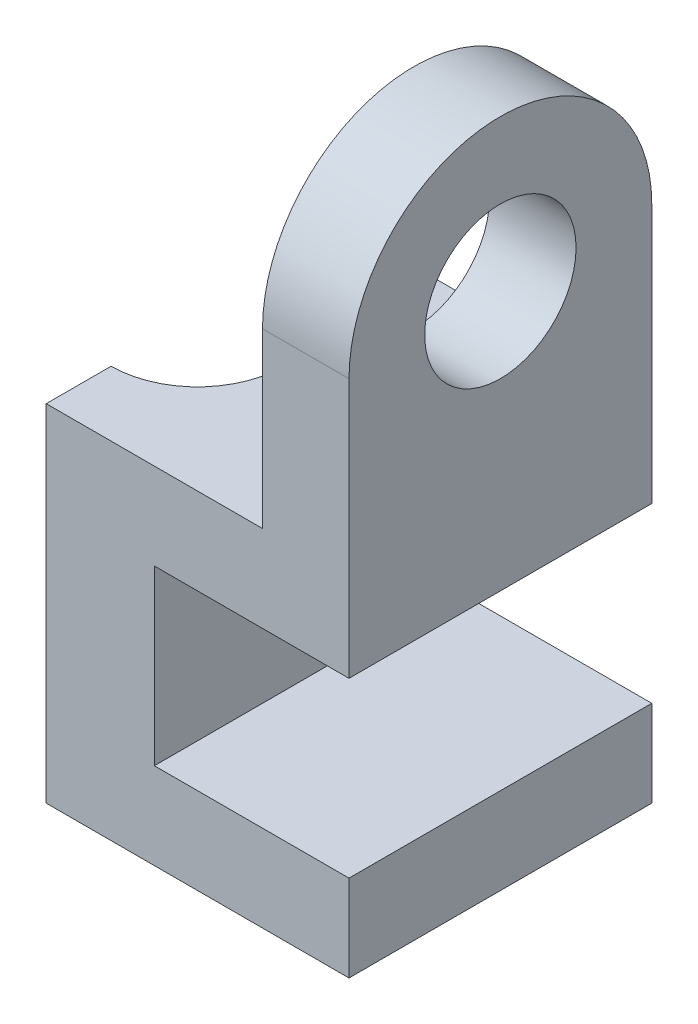
ISO-10303-21;
HEADER;
FILE_DESCRIPTION(('STEP AP214'),'2;1');
FILE_NAME('part.step','',(''),(''),'','','');
FILE_SCHEMA(('AUTOMOTIVE_DESIGN { 1 0 10303 214 1 1 1 1 }'));
ENDSEC;
DATA;
#1=APPLICATION_CONTEXT('core data for automotive mechanical design processes');
#2=APPLICATION_PROTOCOL_DEFINITION('international standard','automotive_design',2000,#1);
#3=PRODUCT_CONTEXT('',#1,'mechanical');
#4=PRODUCT('Part','Part','',(#3));
#5=PRODUCT_RELATED_PRODUCT_CATEGORY('part','',(#4));
#6=PRODUCT_DEFINITION_FORMATION('','',#4);
#7=PRODUCT_DEFINITION_CONTEXT('part definition',#1,'design');
#8=PRODUCT_DEFINITION('design','',#6,#7);
#9=PRODUCT_DEFINITION_SHAPE('','',#8);
#10=(LENGTH_UNIT() NAMED_UNIT(*) SI_UNIT(.MILLI.,.METRE.));
#11=(NAMED_UNIT(*) PLANE_ANGLE_UNIT() SI_UNIT($,.RADIAN.));
#12=(NAMED_UNIT(*) SI_UNIT($,.STERADIAN.) SOLID_ANGLE_UNIT());
#13=UNCERTAINTY_MEASURE_WITH_UNIT(LENGTH_MEASURE(1.E-05),#10,'distance_accuracy_value','');
#14=(GEOMETRIC_REPRESENTATION_CONTEXT(3) GLOBAL_UNCERTAINTY_ASSIGNED_CONTEXT((#13)) GLOBAL_UNIT_ASSIGNED_CONTEXT((#10,
#11,#12)) REPRESENTATION_CONTEXT('',''));
#15=CARTESIAN_POINT('',(0.,0.,0.));
#16=DIRECTION('',(0.,0.,1.));
#17=DIRECTION('',(1.,0.,0.));
#18=AXIS2_PLACEMENT_3D('',#15,#16,#17);
#19=CARTESIAN_POINT('',(-35.,40.,70.));
#20=DIRECTION('',(1.,0.,0.));
#21=DIRECTION('',(0.,1.,0.));
#22=AXIS2_PLACEMENT_3D('',#19,#20,#21);
#23=PLANE('',#22);
#24=DIRECTION('',(0.,0.,-1.));
#25=VECTOR('',#24,1.);
#26=CARTESIAN_POINT('',(-35.,-40.,70.));
#27=LINE('',#26,#25);
#28=CARTESIAN_POINT('',(-35.,-40.,15.));
#29=VERTEX_POINT('',#28);
#30=CARTESIAN_POINT('',(-35.,-40.,0.));
#31=VERTEX_POINT('',#30);
#32=EDGE_CURVE('E127',#29,#31,#27,.T.);
#33=ORIENTED_EDGE('',*,*,#32,.F.);
#34=DIRECTION('',(0.,1.,0.));
#35=VECTOR('',#34,1.);
#36=CARTESIAN_POINT('',(-35.,-40.,15.));
#37=LINE('',#36,#35);
#38=CARTESIAN_POINT('',(-35.,40.,15.));
#39=VERTEX_POINT('',#38);
#40=EDGE_CURVE('E58',#29,#39,#37,.T.);
#41=ORIENTED_EDGE('',*,*,#40,.T.);
#42=DIRECTION('',(0.,0.,-1.));
#43=VECTOR('',#42,1.);
#44=CARTESIAN_POINT('',(-35.,40.,70.));
#45=LINE('',#44,#43);
#46=CARTESIAN_POINT('',(-35.,40.,0.));
#47=VERTEX_POINT('',#46);
#48=EDGE_CURVE('E42',#39,#47,#45,.T.);
#49=ORIENTED_EDGE('',*,*,#48,.T.);
#50=DIRECTION('',(0.,-1.,0.));
#51=VECTOR('',#50,1.);
#52=CARTESIAN_POINT('',(-35.,40.,0.));
#53=LINE('',#52,#51);
#54=EDGE_CURVE('E133',#47,#31,#53,.T.);
#55=ORIENTED_EDGE('',*,*,#54,.T.);
#56=EDGE_LOOP('',(#33,#41,#49,#55));
#57=FACE_BOUND('',#56,.T.);
#58=ADVANCED_FACE('F33',(#57),#23,.F.);
#59=CARTESIAN_POINT('',(35.,40.,70.));
#60=DIRECTION('',(-1.,0.,0.));
#61=DIRECTION('',(0.,-1.,0.));
#62=AXIS2_PLACEMENT_3D('',#59,#60,#61);
#63=PLANE('',#62);
#64=DIRECTION('',(0.,1.,0.));
#65=VECTOR('',#64,1.);
#66=CARTESIAN_POINT('',(35.,40.,0.));
#67=LINE('',#66,#65);
#68=CARTESIAN_POINT('',(35.,-40.,0.));
#69=VERTEX_POINT('',#68);
#70=CARTESIAN_POINT('',(35.,-20.,0.));
#71=VERTEX_POINT('',#70);
#72=EDGE_CURVE('E139',#69,#71,#67,.T.);
#73=ORIENTED_EDGE('',*,*,#72,.T.);
#74=DIRECTION('',(0.,0.,1.));
#75=VECTOR('',#74,1.);
#76=CARTESIAN_POINT('',(35.,-20.,0.));
#77=LINE('',#76,#75);
#78=CARTESIAN_POINT('',(35.,-20.,70.));
#79=VERTEX_POINT('',#78);
#80=EDGE_CURVE('E154',#71,#79,#77,.T.);
#81=ORIENTED_EDGE('',*,*,#80,.T.);
#82=DIRECTION('',(0.,1.,0.));
#83=VECTOR('',#82,1.);
#84=CARTESIAN_POINT('',(35.,40.,70.));
#85=LINE('',#84,#83);
#86=CARTESIAN_POINT('',(35.,-40.,70.));
#87=VERTEX_POINT('',#86);
#88=EDGE_CURVE('E141',#87,#79,#85,.T.);
#89=ORIENTED_EDGE('',*,*,#88,.F.);
#90=DIRECTION('',(0.,0.,-1.));
#91=VECTOR('',#90,1.);
#92=CARTESIAN_POINT('',(35.,-40.,70.));
#93=LINE('',#92,#91);
#94=EDGE_CURVE('E124',#87,#69,#93,.T.);
#95=ORIENTED_EDGE('',*,*,#94,.T.);
#96=EDGE_LOOP('',(#73,#81,#89,#95));
#97=FACE_BOUND('',#96,.T.);
#98=ADVANCED_FACE('F137',(#97),#63,.F.);
#99=CARTESIAN_POINT('',(35.,80.,35.));
#100=DIRECTION('',(1.,0.,0.));
#101=DIRECTION('',(0.,0.,-1.));
#102=AXIS2_PLACEMENT_3D('',#99,#100,#101);
#103=CIRCLE('',#102,17.5);
#104=CARTESIAN_POINT('',(35.,80.,17.5));
#105=VERTEX_POINT('',#104);
#106=EDGE_CURVE('E183',#105,#105,#103,.T.);
#107=ORIENTED_EDGE('',*,*,#106,.F.);
#108=EDGE_LOOP('',(#107));
#109=FACE_BOUND('',#108,.T.);
#110=CARTESIAN_POINT('',(35.,20.,70.));
#111=VERTEX_POINT('',#110);
#112=CARTESIAN_POINT('',(35.,80.,70.));
#113=VERTEX_POINT('',#112);
#114=EDGE_CURVE('E132',#111,#113,#85,.T.);
#115=ORIENTED_EDGE('',*,*,#114,.F.);
#116=DIRECTION('',(0.,0.,1.));
#117=VECTOR('',#116,1.);
#118=CARTESIAN_POINT('',(35.,20.,0.));
#119=LINE('',#118,#117);
#120=CARTESIAN_POINT('',(35.,20.,0.));
#121=VERTEX_POINT('',#120);
#122=EDGE_CURVE('E206',#121,#111,#119,.T.);
#123=ORIENTED_EDGE('',*,*,#122,.F.);
#124=CARTESIAN_POINT('',(35.,80.,0.));
#125=VERTEX_POINT('',#124);
#126=EDGE_CURVE('E150',#121,#125,#67,.T.);
#127=ORIENTED_EDGE('',*,*,#126,.T.);
#128=CARTESIAN_POINT('',(35.,80.,35.));
#129=DIRECTION('',(1.,0.,0.));
#130=DIRECTION('',(0.,0.,1.));
#131=AXIS2_PLACEMENT_3D('',#128,#129,#130);
#132=CIRCLE('',#131,35.);
#133=EDGE_CURVE('E175',#125,#113,#132,.T.);
#134=ORIENTED_EDGE('',*,*,#133,.T.);
#135=EDGE_LOOP('',(#115,#123,#127,#134));
#136=FACE_BOUND('',#135,.T.);
#137=ADVANCED_FACE('F35',(#109,#136),#63,.F.);
#138=CARTESIAN_POINT('',(-35.,40.,70.));
#139=DIRECTION('',(0.,-1.,0.));
#140=DIRECTION('',(0.,0.,-1.));
#141=AXIS2_PLACEMENT_3D('',#138,#139,#140);
#142=PLANE('',#141);
#143=DIRECTION('',(-1.,0.,0.));
#144=VECTOR('',#143,1.);
#145=CARTESIAN_POINT('',(-35.,40.,70.));
#146=LINE('',#145,#144);
#147=CARTESIAN_POINT('',(15.,40.,70.));
#148=VERTEX_POINT('',#147);
#149=CARTESIAN_POINT('',(-35.,40.,70.));
#150=VERTEX_POINT('',#149);
#151=EDGE_CURVE('E172',#148,#150,#146,.T.);
#152=ORIENTED_EDGE('',*,*,#151,.F.);
#153=DIRECTION('',(0.,0.,-1.));
#154=VECTOR('',#153,1.);
#155=CARTESIAN_POINT('',(15.,40.,70.));
#156=LINE('',#155,#154);
#157=CARTESIAN_POINT('',(15.,40.,0.));
#158=VERTEX_POINT('',#157);
#159=EDGE_CURVE('E170',#148,#158,#156,.T.);
#160=ORIENTED_EDGE('',*,*,#159,.T.);
#161=DIRECTION('',(-1.,0.,0.));
#162=VECTOR('',#161,1.);
#163=CARTESIAN_POINT('',(-35.,40.,0.));
#164=LINE('',#163,#162);
#165=EDGE_CURVE('E149',#158,#47,#164,.T.);
#166=ORIENTED_EDGE('',*,*,#165,.T.);
#167=ORIENTED_EDGE('',*,*,#48,.F.);
#168=CARTESIAN_POINT('',(-35.,40.,35.));
#169=DIRECTION('',(0.,1.,0.));
#170=DIRECTION('',(0.,0.,1.));
#171=AXIS2_PLACEMENT_3D('',#168,#169,#170);
#172=CIRCLE('',#171,20.);
#173=CARTESIAN_POINT('',(-35.,40.,55.));
#174=VERTEX_POINT('',#173);
#175=EDGE_CURVE('E37',#174,#39,#172,.T.);
#176=ORIENTED_EDGE('',*,*,#175,.F.);
#177=EDGE_CURVE('E11',#150,#174,#45,.T.);
#178=ORIENTED_EDGE('',*,*,#177,.F.);
#179=EDGE_LOOP('',(#152,#160,#166,#167,#176,#178));
#180=FACE_BOUND('',#179,.T.);
#181=ADVANCED_FACE('F169',(#180),#142,.F.);
#182=ORIENTED_EDGE('',*,*,#177,.T.);
#183=DIRECTION('',(0.,1.,0.));
#184=VECTOR('',#183,1.);
#185=CARTESIAN_POINT('',(-35.,-40.,55.));
#186=LINE('',#185,#184);
#187=CARTESIAN_POINT('',(-35.,-40.,55.));
#188=VERTEX_POINT('',#187);
#189=EDGE_CURVE('E197',#188,#174,#186,.T.);
#190=ORIENTED_EDGE('',*,*,#189,.F.);
#191=CARTESIAN_POINT('',(-35.,-40.,70.));
#192=VERTEX_POINT('',#191);
#193=EDGE_CURVE('E159',#192,#188,#27,.T.);
#194=ORIENTED_EDGE('',*,*,#193,.F.);
#195=DIRECTION('',(0.,-1.,0.));
#196=VECTOR('',#195,1.);
#197=CARTESIAN_POINT('',(-35.,40.,70.));
#198=LINE('',#197,#196);
#199=EDGE_CURVE('E221',#150,#192,#198,.T.);
#200=ORIENTED_EDGE('',*,*,#199,.F.);
#201=EDGE_LOOP('',(#182,#190,#194,#200));
#202=FACE_BOUND('',#201,.T.);
#203=ADVANCED_FACE('F264',(#202),#23,.F.);
#204=CARTESIAN_POINT('',(-35.,-40.,70.));
#205=DIRECTION('',(0.,1.,0.));
#206=DIRECTION('',(0.,0.,1.));
#207=AXIS2_PLACEMENT_3D('',#204,#205,#206);
#208=PLANE('',#207);
#209=ORIENTED_EDGE('',*,*,#193,.T.);
#210=CARTESIAN_POINT('',(-35.,-40.,35.));
#211=DIRECTION('',(0.,1.,0.));
#212=DIRECTION('',(0.,0.,1.));
#213=AXIS2_PLACEMENT_3D('',#210,#211,#212);
#214=CIRCLE('',#213,20.);
#215=EDGE_CURVE('E73',#188,#29,#214,.T.);
#216=ORIENTED_EDGE('',*,*,#215,.T.);
#217=ORIENTED_EDGE('',*,*,#32,.T.);
#218=DIRECTION('',(1.,0.,0.));
#219=VECTOR('',#218,1.);
#220=CARTESIAN_POINT('',(-35.,-40.,0.));
#221=LINE('',#220,#219);
#222=EDGE_CURVE('E119',#31,#69,#221,.T.);
#223=ORIENTED_EDGE('',*,*,#222,.T.);
#224=ORIENTED_EDGE('',*,*,#94,.F.);
#225=DIRECTION('',(1.,0.,0.));
#226=VECTOR('',#225,1.);
#227=CARTESIAN_POINT('',(-35.,-40.,70.));
#228=LINE('',#227,#226);
#229=EDGE_CURVE('E142',#192,#87,#228,.T.);
#230=ORIENTED_EDGE('',*,*,#229,.F.);
#231=EDGE_LOOP('',(#209,#216,#217,#223,#224,#230));
#232=FACE_BOUND('',#231,.T.);
#233=ADVANCED_FACE('F122',(#232),#208,.F.);
#234=CARTESIAN_POINT('',(0.,0.,70.));
#235=DIRECTION('',(0.,0.,1.));
#236=DIRECTION('',(1.,0.,0.));
#237=AXIS2_PLACEMENT_3D('',#234,#235,#236);
#238=PLANE('',#237);
#239=DIRECTION('',(1.,0.,0.));
#240=VECTOR('',#239,1.);
#241=CARTESIAN_POINT('',(35.,-20.,70.));
#242=LINE('',#241,#240);
#243=CARTESIAN_POINT('',(-9.99999999999998,-20.,70.));
#244=VERTEX_POINT('',#243);
#245=EDGE_CURVE('E203',#244,#79,#242,.T.);
#246=ORIENTED_EDGE('',*,*,#245,.F.);
#247=DIRECTION('',(0.,-1.,0.));
#248=VECTOR('',#247,1.);
#249=CARTESIAN_POINT('',(-9.99999999999998,-20.,70.));
#250=LINE('',#249,#248);
#251=CARTESIAN_POINT('',(-9.99999999999998,20.,70.));
#252=VERTEX_POINT('',#251);
#253=EDGE_CURVE('E210',#252,#244,#250,.T.);
#254=ORIENTED_EDGE('',*,*,#253,.F.);
#255=DIRECTION('',(-1.,0.,0.));
#256=VECTOR('',#255,1.);
#257=CARTESIAN_POINT('',(35.,20.,70.));
#258=LINE('',#257,#256);
#259=EDGE_CURVE('E207',#111,#252,#258,.T.);
#260=ORIENTED_EDGE('',*,*,#259,.F.);
#261=ORIENTED_EDGE('',*,*,#114,.T.);
#262=DIRECTION('',(1.,0.,0.));
#263=VECTOR('',#262,1.);
#264=CARTESIAN_POINT('',(15.,80.,70.));
#265=LINE('',#264,#263);
#266=CARTESIAN_POINT('',(15.,80.,70.));
#267=VERTEX_POINT('',#266);
#268=EDGE_CURVE('E191',#267,#113,#265,.T.);
#269=ORIENTED_EDGE('',*,*,#268,.F.);
#270=DIRECTION('',(0.,-1.,0.));
#271=VECTOR('',#270,1.);
#272=CARTESIAN_POINT('',(15.,40.,70.));
#273=LINE('',#272,#271);
#274=EDGE_CURVE('E188',#267,#148,#273,.T.);
#275=ORIENTED_EDGE('',*,*,#274,.T.);
#276=ORIENTED_EDGE('',*,*,#151,.T.);
#277=ORIENTED_EDGE('',*,*,#199,.T.);
#278=ORIENTED_EDGE('',*,*,#229,.T.);
#279=ORIENTED_EDGE('',*,*,#88,.T.);
#280=EDGE_LOOP('',(#246,#254,#260,#261,#269,#275,#276,#277,#278,#279));
#281=FACE_BOUND('',#280,.T.);
#282=ADVANCED_FACE('F225',(#281),#238,.T.);
#283=CARTESIAN_POINT('',(0.,0.,0.));
#284=DIRECTION('',(0.,0.,1.));
#285=DIRECTION('',(1.,0.,0.));
#286=AXIS2_PLACEMENT_3D('',#283,#284,#285);
#287=PLANE('',#286);
#288=DIRECTION('',(0.,-1.,0.));
#289=VECTOR('',#288,1.);
#290=CARTESIAN_POINT('',(-9.99999999999998,-20.,0.));
#291=LINE('',#290,#289);
#292=CARTESIAN_POINT('',(-9.99999999999998,20.,0.));
#293=VERTEX_POINT('',#292);
#294=CARTESIAN_POINT('',(-9.99999999999998,-20.,0.));
#295=VERTEX_POINT('',#294);
#296=EDGE_CURVE('E202',#293,#295,#291,.T.);
#297=ORIENTED_EDGE('',*,*,#296,.T.);
#298=DIRECTION('',(1.,0.,0.));
#299=VECTOR('',#298,1.);
#300=CARTESIAN_POINT('',(35.,-20.,0.));
#301=LINE('',#300,#299);
#302=EDGE_CURVE('E148',#295,#71,#301,.T.);
#303=ORIENTED_EDGE('',*,*,#302,.T.);
#304=ORIENTED_EDGE('',*,*,#72,.F.);
#305=ORIENTED_EDGE('',*,*,#222,.F.);
#306=ORIENTED_EDGE('',*,*,#54,.F.);
#307=ORIENTED_EDGE('',*,*,#165,.F.);
#308=DIRECTION('',(0.,1.,0.));
#309=VECTOR('',#308,1.);
#310=CARTESIAN_POINT('',(15.,80.,0.));
#311=LINE('',#310,#309);
#312=CARTESIAN_POINT('',(15.,80.,0.));
#313=VERTEX_POINT('',#312);
#314=EDGE_CURVE('E49',#158,#313,#311,.T.);
#315=ORIENTED_EDGE('',*,*,#314,.T.);
#316=DIRECTION('',(1.,0.,0.));
#317=VECTOR('',#316,1.);
#318=CARTESIAN_POINT('',(15.,80.,0.));
#319=LINE('',#318,#317);
#320=EDGE_CURVE('E189',#313,#125,#319,.T.);
#321=ORIENTED_EDGE('',*,*,#320,.T.);
#322=ORIENTED_EDGE('',*,*,#126,.F.);
#323=DIRECTION('',(-1.,0.,0.));
#324=VECTOR('',#323,1.);
#325=CARTESIAN_POINT('',(35.,20.,0.));
#326=LINE('',#325,#324);
#327=EDGE_CURVE('E199',#121,#293,#326,.T.);
#328=ORIENTED_EDGE('',*,*,#327,.T.);
#329=EDGE_LOOP('',(#297,#303,#304,#305,#306,#307,#315,#321,#322,#328));
#330=FACE_BOUND('',#329,.T.);
#331=ADVANCED_FACE('F146',(#330),#287,.F.);
#332=CARTESIAN_POINT('',(35.,-20.,0.));
#333=DIRECTION('',(0.,-1.,0.));
#334=DIRECTION('',(1.,0.,0.));
#335=AXIS2_PLACEMENT_3D('',#332,#333,#334);
#336=PLANE('',#335);
#337=ORIENTED_EDGE('',*,*,#245,.T.);
#338=ORIENTED_EDGE('',*,*,#80,.F.);
#339=ORIENTED_EDGE('',*,*,#302,.F.);
#340=DIRECTION('',(0.,0.,1.));
#341=VECTOR('',#340,1.);
#342=CARTESIAN_POINT('',(-9.99999999999998,-20.,0.));
#343=LINE('',#342,#341);
#344=EDGE_CURVE('E215',#295,#244,#343,.T.);
#345=ORIENTED_EDGE('',*,*,#344,.T.);
#346=EDGE_LOOP('',(#337,#338,#339,#345));
#347=FACE_BOUND('',#346,.T.);
#348=ADVANCED_FACE('F229',(#347),#336,.F.);
#349=CARTESIAN_POINT('',(-9.99999999999998,-20.,0.));
#350=DIRECTION('',(-1.,0.,0.));
#351=DIRECTION('',(0.,0.,1.));
#352=AXIS2_PLACEMENT_3D('',#349,#350,#351);
#353=PLANE('',#352);
#354=ORIENTED_EDGE('',*,*,#253,.T.);
#355=ORIENTED_EDGE('',*,*,#344,.F.);
#356=ORIENTED_EDGE('',*,*,#296,.F.);
#357=DIRECTION('',(0.,0.,1.));
#358=VECTOR('',#357,1.);
#359=CARTESIAN_POINT('',(-9.99999999999998,20.,0.));
#360=LINE('',#359,#358);
#361=EDGE_CURVE('E217',#293,#252,#360,.T.);
#362=ORIENTED_EDGE('',*,*,#361,.T.);
#363=EDGE_LOOP('',(#354,#355,#356,#362));
#364=FACE_BOUND('',#363,.T.);
#365=ADVANCED_FACE('F231',(#364),#353,.F.);
#366=CARTESIAN_POINT('',(35.,20.,0.));
#367=DIRECTION('',(0.,1.,0.));
#368=DIRECTION('',(-1.,0.,0.));
#369=AXIS2_PLACEMENT_3D('',#366,#367,#368);
#370=PLANE('',#369);
#371=ORIENTED_EDGE('',*,*,#259,.T.);
#372=ORIENTED_EDGE('',*,*,#361,.F.);
#373=ORIENTED_EDGE('',*,*,#327,.F.);
#374=ORIENTED_EDGE('',*,*,#122,.T.);
#375=EDGE_LOOP('',(#371,#372,#373,#374));
#376=FACE_BOUND('',#375,.T.);
#377=ADVANCED_FACE('F234',(#376),#370,.F.);
#378=CARTESIAN_POINT('',(-35.,-40.,35.));
#379=DIRECTION('',(0.,1.,0.));
#380=DIRECTION('',(0.,0.,1.));
#381=AXIS2_PLACEMENT_3D('',#378,#379,#380);
#382=CYLINDRICAL_SURFACE('',#381,20.);
#383=ORIENTED_EDGE('',*,*,#40,.F.);
#384=ORIENTED_EDGE('',*,*,#215,.F.);
#385=ORIENTED_EDGE('',*,*,#189,.T.);
#386=ORIENTED_EDGE('',*,*,#175,.T.);
#387=EDGE_LOOP('',(#383,#384,#385,#386));
#388=FACE_BOUND('',#387,.T.);
#389=ADVANCED_FACE('F259',(#388),#382,.F.);
#390=CARTESIAN_POINT('',(15.,80.,35.));
#391=DIRECTION('',(1.,0.,0.));
#392=DIRECTION('',(0.,0.,-1.));
#393=AXIS2_PLACEMENT_3D('',#390,#391,#392);
#394=CYLINDRICAL_SURFACE('',#393,35.);
#395=ORIENTED_EDGE('',*,*,#133,.F.);
#396=ORIENTED_EDGE('',*,*,#320,.F.);
#397=CARTESIAN_POINT('',(15.,80.,35.));
#398=DIRECTION('',(1.,0.,0.));
#399=DIRECTION('',(0.,0.,1.));
#400=AXIS2_PLACEMENT_3D('',#397,#398,#399);
#401=CIRCLE('',#400,35.);
#402=EDGE_CURVE('E177',#313,#267,#401,.T.);
#403=ORIENTED_EDGE('',*,*,#402,.T.);
#404=ORIENTED_EDGE('',*,*,#268,.T.);
#405=EDGE_LOOP('',(#395,#396,#403,#404));
#406=FACE_BOUND('',#405,.T.);
#407=ADVANCED_FACE('F245',(#406),#394,.T.);
#408=CARTESIAN_POINT('',(15.,80.,35.));
#409=DIRECTION('',(-1.,0.,0.));
#410=DIRECTION('',(0.,0.,1.));
#411=AXIS2_PLACEMENT_3D('',#408,#409,#410);
#412=PLANE('',#411);
#413=CARTESIAN_POINT('',(15.,80.,35.));
#414=DIRECTION('',(1.,0.,0.));
#415=DIRECTION('',(0.,0.,-1.));
#416=AXIS2_PLACEMENT_3D('',#413,#414,#415);
#417=CIRCLE('',#416,17.5);
#418=CARTESIAN_POINT('',(15.,80.,17.5));
#419=VERTEX_POINT('',#418);
#420=EDGE_CURVE('E180',#419,#419,#417,.T.);
#421=ORIENTED_EDGE('',*,*,#420,.T.);
#422=EDGE_LOOP('',(#421));
#423=FACE_BOUND('',#422,.T.);
#424=ORIENTED_EDGE('',*,*,#159,.F.);
#425=ORIENTED_EDGE('',*,*,#274,.F.);
#426=ORIENTED_EDGE('',*,*,#402,.F.);
#427=ORIENTED_EDGE('',*,*,#314,.F.);
#428=EDGE_LOOP('',(#424,#425,#426,#427));
#429=FACE_BOUND('',#428,.T.);
#430=ADVANCED_FACE('F248',(#423,#429),#412,.T.);
#431=CARTESIAN_POINT('',(15.,80.,35.));
#432=DIRECTION('',(1.,0.,0.));
#433=DIRECTION('',(0.,0.,-1.));
#434=AXIS2_PLACEMENT_3D('',#431,#432,#433);
#435=CYLINDRICAL_SURFACE('',#434,17.5);
#436=ORIENTED_EDGE('',*,*,#420,.F.);
#437=EDGE_LOOP('',(#436));
#438=FACE_BOUND('',#437,.T.);
#439=ORIENTED_EDGE('',*,*,#106,.T.);
#440=EDGE_LOOP('',(#439));
#441=FACE_BOUND('',#440,.T.);
#442=ADVANCED_FACE('F250',(#438,#441),#435,.F.);
#443=CLOSED_SHELL('',(#58,#98,#137,#181,#203,#233,#282,#331,#348,#365,#377,#389,#407,#430,#442));
#444=MANIFOLD_SOLID_BREP('B2',#443);
#445=ADVANCED_BREP_SHAPE_REPRESENTATION('',(#18,#444),#14);
#446=SHAPE_DEFINITION_REPRESENTATION(#9,#445);
ENDSEC;
END-ISO-10303-21;
